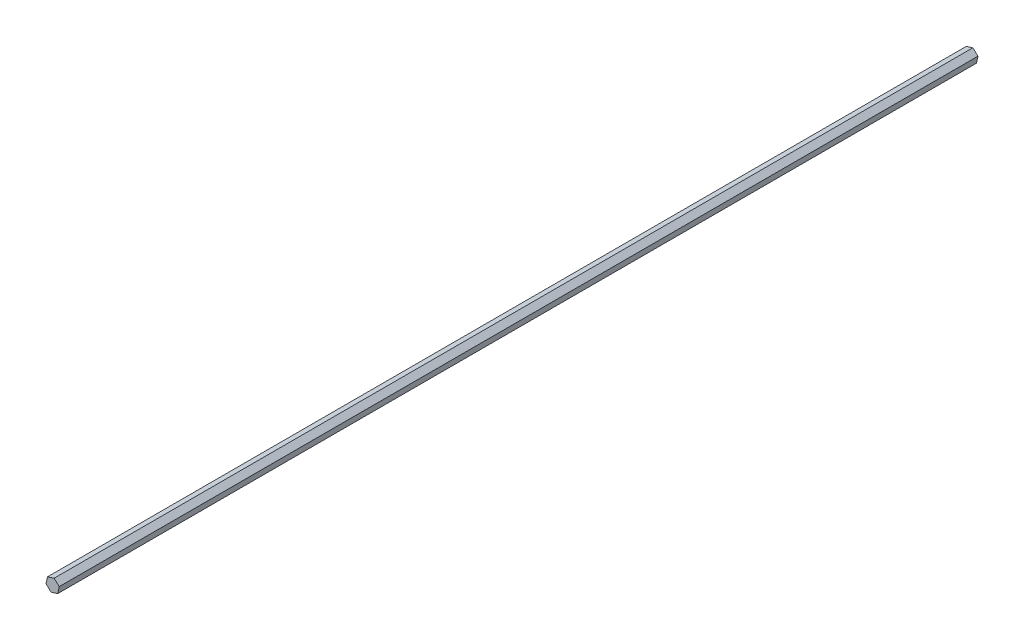
ISO-10303-21;
HEADER;
FILE_DESCRIPTION(('STEP AP214'),'2;1');
FILE_NAME('part.step','',(''),(''),'','','');
FILE_SCHEMA(('AUTOMOTIVE_DESIGN { 1 0 10303 214 1 1 1 1 }'));
ENDSEC;
DATA;
#1=APPLICATION_CONTEXT('core data for automotive mechanical design processes');
#2=APPLICATION_PROTOCOL_DEFINITION('international standard','automotive_design',2000,#1);
#3=PRODUCT_CONTEXT('',#1,'mechanical');
#4=PRODUCT('Part','Part','',(#3));
#5=PRODUCT_RELATED_PRODUCT_CATEGORY('part','',(#4));
#6=PRODUCT_DEFINITION_FORMATION('','',#4);
#7=PRODUCT_DEFINITION_CONTEXT('part definition',#1,'design');
#8=PRODUCT_DEFINITION('design','',#6,#7);
#9=PRODUCT_DEFINITION_SHAPE('','',#8);
#10=(LENGTH_UNIT() NAMED_UNIT(*) SI_UNIT(.MILLI.,.METRE.));
#11=(NAMED_UNIT(*) PLANE_ANGLE_UNIT() SI_UNIT($,.RADIAN.));
#12=(NAMED_UNIT(*) SI_UNIT($,.STERADIAN.) SOLID_ANGLE_UNIT());
#13=UNCERTAINTY_MEASURE_WITH_UNIT(LENGTH_MEASURE(1.E-05),#10,'distance_accuracy_value','');
#14=(GEOMETRIC_REPRESENTATION_CONTEXT(3) GLOBAL_UNCERTAINTY_ASSIGNED_CONTEXT((#13)) GLOBAL_UNIT_ASSIGNED_CONTEXT((#10,
#11,#12)) REPRESENTATION_CONTEXT('',''));
#15=CARTESIAN_POINT('',(0.,0.,0.));
#16=DIRECTION('',(0.,0.,1.));
#17=DIRECTION('',(1.,0.,0.));
#18=AXIS2_PLACEMENT_3D('',#15,#16,#17);
#19=CARTESIAN_POINT('',(-0.61182187926995,-2.82117126764399,381.));
#20=DIRECTION('',(-0.305094633460301,0.952322038300976,0.));
#21=DIRECTION('',(-0.952322038300976,-0.305094633460301,0.));
#22=AXIS2_PLACEMENT_3D('',#19,#20,#21);
#23=PLANE('',#22);
#24=DIRECTION('',(0.952322038300976,0.305094633460301,0.));
#25=VECTOR('',#24,1.);
#26=CARTESIAN_POINT('',(-0.61182187926995,-2.82117126764399,0.));
#27=LINE('',#26,#25);
#28=CARTESIAN_POINT('',(-0.61182187926995,-2.82117126764399,0.));
#29=VERTEX_POINT('',#28);
#30=CARTESIAN_POINT('',(2.13729504657146,-1.94043892386091,0.));
#31=VERTEX_POINT('',#30);
#32=EDGE_CURVE('E119',#29,#31,#27,.T.);
#33=ORIENTED_EDGE('',*,*,#32,.T.);
#34=DIRECTION('',(0.,0.,-1.));
#35=VECTOR('',#34,1.);
#36=CARTESIAN_POINT('',(2.13729504657146,-1.94043892386091,381.));
#37=LINE('',#36,#35);
#38=CARTESIAN_POINT('',(2.13729504657146,-1.94043892386091,381.));
#39=VERTEX_POINT('',#38);
#40=EDGE_CURVE('E11',#39,#31,#37,.T.);
#41=ORIENTED_EDGE('',*,*,#40,.F.);
#42=DIRECTION('',(0.952322038300976,0.305094633460301,0.));
#43=VECTOR('',#42,1.);
#44=CARTESIAN_POINT('',(-0.61182187926995,-2.82117126764399,381.));
#45=LINE('',#44,#43);
#46=CARTESIAN_POINT('',(-0.61182187926995,-2.82117126764399,381.));
#47=VERTEX_POINT('',#46);
#48=EDGE_CURVE('E129',#47,#39,#45,.T.);
#49=ORIENTED_EDGE('',*,*,#48,.F.);
#50=DIRECTION('',(0.,0.,-1.));
#51=VECTOR('',#50,1.);
#52=CARTESIAN_POINT('',(-0.61182187926995,-2.82117126764399,381.));
#53=LINE('',#52,#51);
#54=EDGE_CURVE('E115',#47,#29,#53,.T.);
#55=ORIENTED_EDGE('',*,*,#54,.T.);
#56=EDGE_LOOP('',(#33,#41,#49,#55));
#57=FACE_BOUND('',#56,.T.);
#58=ADVANCED_FACE('F35',(#57),#23,.F.);
#59=CARTESIAN_POINT('',(2.13729504657146,-1.94043892386091,381.));
#60=DIRECTION('',(-0.977282394482572,0.211941316015566,0.));
#61=DIRECTION('',(-0.211941316015566,-0.977282394482572,0.));
#62=AXIS2_PLACEMENT_3D('',#59,#60,#61);
#63=PLANE('',#62);
#64=DIRECTION('',(0.211941316015566,0.977282394482572,0.));
#65=VECTOR('',#64,1.);
#66=CARTESIAN_POINT('',(2.13729504657146,-1.94043892386091,0.));
#67=LINE('',#66,#65);
#68=CARTESIAN_POINT('',(2.74911692584142,0.880732343783076,0.));
#69=VERTEX_POINT('',#68);
#70=EDGE_CURVE('E122',#31,#69,#67,.T.);
#71=ORIENTED_EDGE('',*,*,#70,.T.);
#72=DIRECTION('',(0.,0.,-1.));
#73=VECTOR('',#72,1.);
#74=CARTESIAN_POINT('',(2.74911692584142,0.880732343783076,381.));
#75=LINE('',#74,#73);
#76=CARTESIAN_POINT('',(2.74911692584142,0.880732343783076,381.));
#77=VERTEX_POINT('',#76);
#78=EDGE_CURVE('E43',#77,#69,#75,.T.);
#79=ORIENTED_EDGE('',*,*,#78,.F.);
#80=DIRECTION('',(0.211941316015566,0.977282394482572,0.));
#81=VECTOR('',#80,1.);
#82=CARTESIAN_POINT('',(2.13729504657146,-1.94043892386091,381.));
#83=LINE('',#82,#81);
#84=EDGE_CURVE('E88',#39,#77,#83,.T.);
#85=ORIENTED_EDGE('',*,*,#84,.F.);
#86=ORIENTED_EDGE('',*,*,#40,.T.);
#87=EDGE_LOOP('',(#71,#79,#85,#86));
#88=FACE_BOUND('',#87,.T.);
#89=ADVANCED_FACE('F153',(#88),#63,.F.);
#90=CARTESIAN_POINT('',(2.74911692584142,0.880732343783076,381.));
#91=DIRECTION('',(-0.672187761022271,-0.74038072228541,0.));
#92=DIRECTION('',(0.74038072228541,-0.672187761022271,0.));
#93=AXIS2_PLACEMENT_3D('',#90,#91,#92);
#94=PLANE('',#93);
#95=DIRECTION('',(-0.74038072228541,0.672187761022271,0.));
#96=VECTOR('',#95,1.);
#97=CARTESIAN_POINT('',(2.74911692584142,0.880732343783076,0.));
#98=LINE('',#97,#96);
#99=CARTESIAN_POINT('',(0.611821879269952,2.82117126764399,0.));
#100=VERTEX_POINT('',#99);
#101=EDGE_CURVE('E124',#69,#100,#98,.T.);
#102=ORIENTED_EDGE('',*,*,#101,.T.);
#103=DIRECTION('',(0.,0.,-1.));
#104=VECTOR('',#103,1.);
#105=CARTESIAN_POINT('',(0.611821879269952,2.82117126764399,381.));
#106=LINE('',#105,#104);
#107=CARTESIAN_POINT('',(0.611821879269952,2.82117126764399,381.));
#108=VERTEX_POINT('',#107);
#109=EDGE_CURVE('E110',#108,#100,#106,.T.);
#110=ORIENTED_EDGE('',*,*,#109,.F.);
#111=DIRECTION('',(-0.74038072228541,0.672187761022271,0.));
#112=VECTOR('',#111,1.);
#113=CARTESIAN_POINT('',(2.74911692584142,0.880732343783076,381.));
#114=LINE('',#113,#112);
#115=EDGE_CURVE('E101',#77,#108,#114,.T.);
#116=ORIENTED_EDGE('',*,*,#115,.F.);
#117=ORIENTED_EDGE('',*,*,#78,.T.);
#118=EDGE_LOOP('',(#102,#110,#116,#117));
#119=FACE_BOUND('',#118,.T.);
#120=ADVANCED_FACE('F135',(#119),#94,.F.);
#121=CARTESIAN_POINT('',(0.611821879269952,2.82117126764399,381.));
#122=DIRECTION('',(0.305094633460301,-0.952322038300976,0.));
#123=DIRECTION('',(0.952322038300976,0.305094633460301,0.));
#124=AXIS2_PLACEMENT_3D('',#121,#122,#123);
#125=PLANE('',#124);
#126=DIRECTION('',(-0.952322038300976,-0.305094633460301,0.));
#127=VECTOR('',#126,1.);
#128=CARTESIAN_POINT('',(0.611821879269952,2.82117126764399,0.));
#129=LINE('',#128,#127);
#130=CARTESIAN_POINT('',(-2.13729504657146,1.94043892386091,0.));
#131=VERTEX_POINT('',#130);
#132=EDGE_CURVE('E109',#100,#131,#129,.T.);
#133=ORIENTED_EDGE('',*,*,#132,.T.);
#134=DIRECTION('',(0.,0.,-1.));
#135=VECTOR('',#134,1.);
#136=CARTESIAN_POINT('',(-2.13729504657146,1.94043892386091,381.));
#137=LINE('',#136,#135);
#138=CARTESIAN_POINT('',(-2.13729504657146,1.94043892386091,381.));
#139=VERTEX_POINT('',#138);
#140=EDGE_CURVE('E106',#139,#131,#137,.T.);
#141=ORIENTED_EDGE('',*,*,#140,.F.);
#142=DIRECTION('',(-0.952322038300976,-0.305094633460301,0.));
#143=VECTOR('',#142,1.);
#144=CARTESIAN_POINT('',(0.611821879269952,2.82117126764399,381.));
#145=LINE('',#144,#143);
#146=EDGE_CURVE('E95',#108,#139,#145,.T.);
#147=ORIENTED_EDGE('',*,*,#146,.F.);
#148=ORIENTED_EDGE('',*,*,#109,.T.);
#149=EDGE_LOOP('',(#133,#141,#147,#148));
#150=FACE_BOUND('',#149,.T.);
#151=ADVANCED_FACE('F107',(#150),#125,.F.);
#152=CARTESIAN_POINT('',(-2.13729504657146,1.94043892386091,381.));
#153=DIRECTION('',(0.977282394482572,-0.211941316015565,0.));
#154=DIRECTION('',(0.211941316015565,0.977282394482572,0.));
#155=AXIS2_PLACEMENT_3D('',#152,#153,#154);
#156=PLANE('',#155);
#157=DIRECTION('',(-0.211941316015565,-0.977282394482572,0.));
#158=VECTOR('',#157,1.);
#159=CARTESIAN_POINT('',(-2.13729504657146,1.94043892386091,0.));
#160=LINE('',#159,#158);
#161=CARTESIAN_POINT('',(-2.74911692584141,-0.88073234378308,0.));
#162=VERTEX_POINT('',#161);
#163=EDGE_CURVE('E74',#131,#162,#160,.T.);
#164=ORIENTED_EDGE('',*,*,#163,.T.);
#165=DIRECTION('',(0.,0.,-1.));
#166=VECTOR('',#165,1.);
#167=CARTESIAN_POINT('',(-2.74911692584141,-0.88073234378308,381.));
#168=LINE('',#167,#166);
#169=CARTESIAN_POINT('',(-2.74911692584141,-0.88073234378308,381.));
#170=VERTEX_POINT('',#169);
#171=EDGE_CURVE('E111',#170,#162,#168,.T.);
#172=ORIENTED_EDGE('',*,*,#171,.F.);
#173=DIRECTION('',(-0.211941316015565,-0.977282394482572,0.));
#174=VECTOR('',#173,1.);
#175=CARTESIAN_POINT('',(-2.13729504657146,1.94043892386091,381.));
#176=LINE('',#175,#174);
#177=EDGE_CURVE('E99',#139,#170,#176,.T.);
#178=ORIENTED_EDGE('',*,*,#177,.F.);
#179=ORIENTED_EDGE('',*,*,#140,.T.);
#180=EDGE_LOOP('',(#164,#172,#178,#179));
#181=FACE_BOUND('',#180,.T.);
#182=ADVANCED_FACE('F113',(#181),#156,.F.);
#183=CARTESIAN_POINT('',(-2.74911692584141,-0.88073234378308,381.));
#184=DIRECTION('',(0.672187761022271,0.740380722285411,0.));
#185=DIRECTION('',(-0.740380722285411,0.672187761022271,0.));
#186=AXIS2_PLACEMENT_3D('',#183,#184,#185);
#187=PLANE('',#186);
#188=DIRECTION('',(0.740380722285411,-0.672187761022271,0.));
#189=VECTOR('',#188,1.);
#190=CARTESIAN_POINT('',(-2.74911692584141,-0.88073234378308,0.));
#191=LINE('',#190,#189);
#192=EDGE_CURVE('E80',#162,#29,#191,.T.);
#193=ORIENTED_EDGE('',*,*,#192,.T.);
#194=ORIENTED_EDGE('',*,*,#54,.F.);
#195=DIRECTION('',(0.740380722285411,-0.672187761022271,0.));
#196=VECTOR('',#195,1.);
#197=CARTESIAN_POINT('',(-2.74911692584141,-0.88073234378308,381.));
#198=LINE('',#197,#196);
#199=EDGE_CURVE('E51',#170,#47,#198,.T.);
#200=ORIENTED_EDGE('',*,*,#199,.F.);
#201=ORIENTED_EDGE('',*,*,#171,.T.);
#202=EDGE_LOOP('',(#193,#194,#200,#201));
#203=FACE_BOUND('',#202,.T.);
#204=ADVANCED_FACE('F142',(#203),#187,.F.);
#205=CARTESIAN_POINT('',(0.,0.,381.));
#206=DIRECTION('',(0.,0.,1.));
#207=DIRECTION('',(1.,0.,0.));
#208=AXIS2_PLACEMENT_3D('',#205,#206,#207);
#209=PLANE('',#208);
#210=ORIENTED_EDGE('',*,*,#48,.T.);
#211=ORIENTED_EDGE('',*,*,#84,.T.);
#212=ORIENTED_EDGE('',*,*,#115,.T.);
#213=ORIENTED_EDGE('',*,*,#146,.T.);
#214=ORIENTED_EDGE('',*,*,#177,.T.);
#215=ORIENTED_EDGE('',*,*,#199,.T.);
#216=EDGE_LOOP('',(#210,#211,#212,#213,#214,#215));
#217=FACE_BOUND('',#216,.T.);
#218=ADVANCED_FACE('F97',(#217),#209,.T.);
#219=CARTESIAN_POINT('',(0.,0.,0.));
#220=DIRECTION('',(0.,0.,1.));
#221=DIRECTION('',(1.,0.,0.));
#222=AXIS2_PLACEMENT_3D('',#219,#220,#221);
#223=PLANE('',#222);
#224=ORIENTED_EDGE('',*,*,#32,.F.);
#225=ORIENTED_EDGE('',*,*,#192,.F.);
#226=ORIENTED_EDGE('',*,*,#163,.F.);
#227=ORIENTED_EDGE('',*,*,#132,.F.);
#228=ORIENTED_EDGE('',*,*,#101,.F.);
#229=ORIENTED_EDGE('',*,*,#70,.F.);
#230=EDGE_LOOP('',(#224,#225,#226,#227,#228,#229));
#231=FACE_BOUND('',#230,.T.);
#232=ADVANCED_FACE('F138',(#231),#223,.F.);
#233=CLOSED_SHELL('',(#58,#89,#120,#151,#182,#204,#218,#232));
#234=MANIFOLD_SOLID_BREP('B2',#233);
#235=ADVANCED_BREP_SHAPE_REPRESENTATION('',(#18,#234),#14);
#236=SHAPE_DEFINITION_REPRESENTATION(#9,#235);
ENDSEC;
END-ISO-10303-21;
